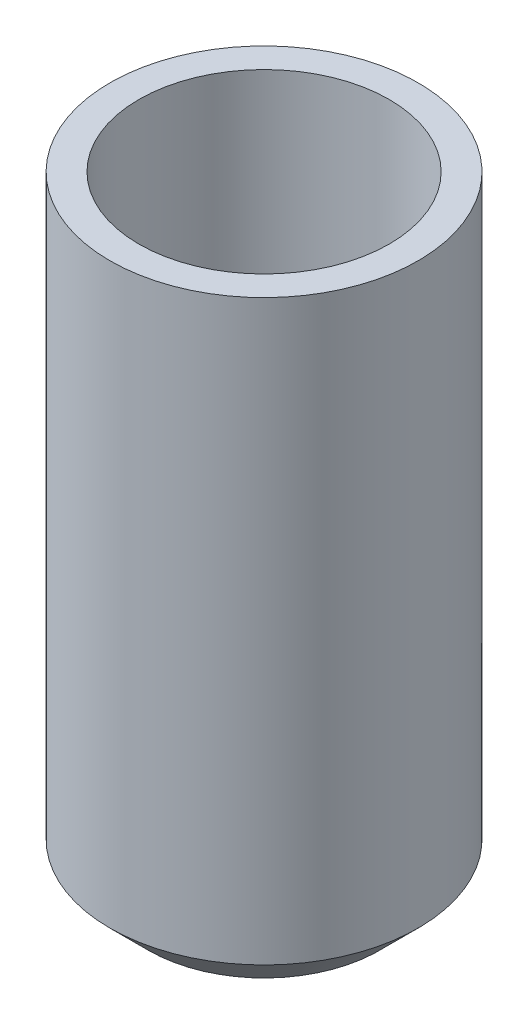
ISO-10303-21;
HEADER;
FILE_DESCRIPTION(('STEP AP214'),'2;1');
FILE_NAME('part.step','',(''),(''),'','','');
FILE_SCHEMA(('AUTOMOTIVE_DESIGN { 1 0 10303 214 1 1 1 1 }'));
ENDSEC;
DATA;
#1=APPLICATION_CONTEXT('core data for automotive mechanical design processes');
#2=APPLICATION_PROTOCOL_DEFINITION('international standard','automotive_design',2000,#1);
#3=PRODUCT_CONTEXT('',#1,'mechanical');
#4=PRODUCT('Part','Part','',(#3));
#5=PRODUCT_RELATED_PRODUCT_CATEGORY('part','',(#4));
#6=PRODUCT_DEFINITION_FORMATION('','',#4);
#7=PRODUCT_DEFINITION_CONTEXT('part definition',#1,'design');
#8=PRODUCT_DEFINITION('design','',#6,#7);
#9=PRODUCT_DEFINITION_SHAPE('','',#8);
#10=(LENGTH_UNIT() NAMED_UNIT(*) SI_UNIT(.MILLI.,.METRE.));
#11=(NAMED_UNIT(*) PLANE_ANGLE_UNIT() SI_UNIT($,.RADIAN.));
#12=(NAMED_UNIT(*) SI_UNIT($,.STERADIAN.) SOLID_ANGLE_UNIT());
#13=UNCERTAINTY_MEASURE_WITH_UNIT(LENGTH_MEASURE(1.E-05),#10,'distance_accuracy_value','');
#14=(GEOMETRIC_REPRESENTATION_CONTEXT(3) GLOBAL_UNCERTAINTY_ASSIGNED_CONTEXT((#13)) GLOBAL_UNIT_ASSIGNED_CONTEXT((#10,
#11,#12)) REPRESENTATION_CONTEXT('',''));
#15=CARTESIAN_POINT('',(0.,0.,0.));
#16=DIRECTION('',(0.,0.,1.));
#17=DIRECTION('',(1.,0.,0.));
#18=AXIS2_PLACEMENT_3D('',#15,#16,#17);
#19=CARTESIAN_POINT('',(0.,-4.48308405515468,0.));
#20=DIRECTION('',(0.,1.,0.));
#21=DIRECTION('',(0.,0.,-1.));
#22=AXIS2_PLACEMENT_3D('',#19,#20,#21);
#23=SPHERICAL_SURFACE('',#22,6.5437442269345);
#24=CARTESIAN_POINT('',(0.,1.5,0.));
#25=DIRECTION('',(0.,1.,0.));
#26=DIRECTION('',(0.,0.,1.));
#27=AXIS2_PLACEMENT_3D('',#24,#25,#26);
#28=CIRCLE('',#27,2.65014974982404);
#29=CARTESIAN_POINT('',(0.,1.5,2.65014974982404));
#30=VERTEX_POINT('',#29);
#31=EDGE_CURVE('E10',#30,#30,#28,.T.);
#32=ORIENTED_EDGE('',*,*,#31,.T.);
#33=EDGE_LOOP('',(#32));
#34=FACE_BOUND('',#33,.T.);
#35=ADVANCED_FACE('F40',(#34),#23,.T.);
#36=CARTESIAN_POINT('',(0.,1.5,-2.65014974982404));
#37=DIRECTION('',(0.,-1.,0.));
#38=DIRECTION('',(0.,0.,-1.));
#39=AXIS2_PLACEMENT_3D('',#36,#37,#38);
#40=PLANE('',#39);
#41=ORIENTED_EDGE('',*,*,#31,.F.);
#42=EDGE_LOOP('',(#41));
#43=FACE_BOUND('',#42,.T.);
#44=CARTESIAN_POINT('',(0.,1.5,0.));
#45=DIRECTION('',(0.,1.,0.));
#46=DIRECTION('',(0.,0.,1.));
#47=AXIS2_PLACEMENT_3D('',#44,#45,#46);
#48=CIRCLE('',#47,5.37867965644036);
#49=CARTESIAN_POINT('',(0.,1.5,5.37867965644036));
#50=VERTEX_POINT('',#49);
#51=EDGE_CURVE('E47',#50,#50,#48,.T.);
#52=ORIENTED_EDGE('',*,*,#51,.T.);
#53=EDGE_LOOP('',(#52));
#54=FACE_BOUND('',#53,.T.);
#55=ADVANCED_FACE('F100',(#43,#54),#40,.F.);
#56=CARTESIAN_POINT('',(0.,2.62132034355964,0.));
#57=DIRECTION('',(0.,1.,0.));
#58=DIRECTION('',(0.,0.,1.));
#59=AXIS2_PLACEMENT_3D('',#56,#57,#58);
#60=CONICAL_SURFACE('',#59,6.5,0.785398163397448);
#61=ORIENTED_EDGE('',*,*,#51,.F.);
#62=EDGE_LOOP('',(#61));
#63=FACE_BOUND('',#62,.T.);
#64=CARTESIAN_POINT('',(0.,2.62132034355964,0.));
#65=DIRECTION('',(0.,1.,0.));
#66=DIRECTION('',(0.,0.,1.));
#67=AXIS2_PLACEMENT_3D('',#64,#65,#66);
#68=CIRCLE('',#67,6.5);
#69=CARTESIAN_POINT('',(0.,2.62132034355964,6.5));
#70=VERTEX_POINT('',#69);
#71=EDGE_CURVE('E52',#70,#70,#68,.T.);
#72=ORIENTED_EDGE('',*,*,#71,.T.);
#73=EDGE_LOOP('',(#72));
#74=FACE_BOUND('',#73,.T.);
#75=ADVANCED_FACE('F104',(#63,#74),#60,.F.);
#76=CARTESIAN_POINT('',(0.,2.06066017177982,0.));
#77=DIRECTION('',(0.,1.,0.));
#78=DIRECTION('',(0.,0.,1.));
#79=AXIS2_PLACEMENT_3D('',#76,#77,#78);
#80=CYLINDRICAL_SURFACE('',#79,6.5);
#81=ORIENTED_EDGE('',*,*,#71,.F.);
#82=EDGE_LOOP('',(#81));
#83=FACE_BOUND('',#82,.T.);
#84=CARTESIAN_POINT('',(0.,6.5,0.));
#85=DIRECTION('',(0.,1.,0.));
#86=DIRECTION('',(0.,0.,1.));
#87=AXIS2_PLACEMENT_3D('',#84,#85,#86);
#88=CIRCLE('',#87,6.5);
#89=CARTESIAN_POINT('',(0.,6.5,6.5));
#90=VERTEX_POINT('',#89);
#91=EDGE_CURVE('E57',#90,#90,#88,.T.);
#92=ORIENTED_EDGE('',*,*,#91,.T.);
#93=EDGE_LOOP('',(#92));
#94=FACE_BOUND('',#93,.T.);
#95=ADVANCED_FACE('F109',(#83,#94),#80,.F.);
#96=CARTESIAN_POINT('',(0.,6.5,-5.37867965644036));
#97=DIRECTION('',(0.,1.,0.));
#98=DIRECTION('',(0.,0.,1.));
#99=AXIS2_PLACEMENT_3D('',#96,#97,#98);
#100=PLANE('',#99);
#101=ORIENTED_EDGE('',*,*,#91,.F.);
#102=EDGE_LOOP('',(#101));
#103=FACE_BOUND('',#102,.T.);
#104=CARTESIAN_POINT('',(0.,6.5,0.));
#105=DIRECTION('',(0.,1.,0.));
#106=DIRECTION('',(0.,0.,1.));
#107=AXIS2_PLACEMENT_3D('',#104,#105,#106);
#108=CIRCLE('',#107,5.37867965644036);
#109=CARTESIAN_POINT('',(0.,6.5,5.37867965644036));
#110=VERTEX_POINT('',#109);
#111=EDGE_CURVE('E63',#110,#110,#108,.T.);
#112=ORIENTED_EDGE('',*,*,#111,.T.);
#113=EDGE_LOOP('',(#112));
#114=FACE_BOUND('',#113,.T.);
#115=ADVANCED_FACE('F115',(#103,#114),#100,.F.);
#116=CARTESIAN_POINT('',(0.,12.0606601717798,0.));
#117=DIRECTION('',(0.,1.,0.));
#118=DIRECTION('',(0.,0.,1.));
#119=AXIS2_PLACEMENT_3D('',#116,#117,#118);
#120=CONICAL_SURFACE('',#119,6.5,0.198983878226247);
#121=ORIENTED_EDGE('',*,*,#111,.F.);
#122=EDGE_LOOP('',(#121));
#123=FACE_BOUND('',#122,.T.);
#124=CARTESIAN_POINT('',(0.,12.0606601717798,0.));
#125=DIRECTION('',(0.,1.,0.));
#126=DIRECTION('',(0.,0.,1.));
#127=AXIS2_PLACEMENT_3D('',#124,#125,#126);
#128=CIRCLE('',#127,6.5);
#129=CARTESIAN_POINT('',(0.,12.0606601717798,6.5));
#130=VERTEX_POINT('',#129);
#131=EDGE_CURVE('E67',#130,#130,#128,.T.);
#132=ORIENTED_EDGE('',*,*,#131,.T.);
#133=EDGE_LOOP('',(#132));
#134=FACE_BOUND('',#133,.T.);
#135=ADVANCED_FACE('F119',(#123,#134),#120,.F.);
#136=CARTESIAN_POINT('',(0.,2.06066017177982,0.));
#137=DIRECTION('',(0.,1.,0.));
#138=DIRECTION('',(0.,0.,1.));
#139=AXIS2_PLACEMENT_3D('',#136,#137,#138);
#140=CYLINDRICAL_SURFACE('',#139,6.5);
#141=ORIENTED_EDGE('',*,*,#131,.F.);
#142=EDGE_LOOP('',(#141));
#143=FACE_BOUND('',#142,.T.);
#144=CARTESIAN_POINT('',(0.,32.,0.));
#145=DIRECTION('',(0.,1.,0.));
#146=DIRECTION('',(0.,0.,1.));
#147=AXIS2_PLACEMENT_3D('',#144,#145,#146);
#148=CIRCLE('',#147,6.5);
#149=CARTESIAN_POINT('',(0.,32.,6.5));
#150=VERTEX_POINT('',#149);
#151=EDGE_CURVE('E71',#150,#150,#148,.T.);
#152=ORIENTED_EDGE('',*,*,#151,.T.);
#153=EDGE_LOOP('',(#152));
#154=FACE_BOUND('',#153,.T.);
#155=ADVANCED_FACE('F123',(#143,#154),#140,.F.);
#156=CARTESIAN_POINT('',(0.,32.,-6.5));
#157=DIRECTION('',(0.,-1.,0.));
#158=DIRECTION('',(0.,0.,-1.));
#159=AXIS2_PLACEMENT_3D('',#156,#157,#158);
#160=PLANE('',#159);
#161=ORIENTED_EDGE('',*,*,#151,.F.);
#162=EDGE_LOOP('',(#161));
#163=FACE_BOUND('',#162,.T.);
#164=CARTESIAN_POINT('',(0.,32.,0.));
#165=DIRECTION('',(0.,1.,0.));
#166=DIRECTION('',(0.,0.,1.));
#167=AXIS2_PLACEMENT_3D('',#164,#165,#166);
#168=CIRCLE('',#167,8.);
#169=CARTESIAN_POINT('',(0.,32.,8.));
#170=VERTEX_POINT('',#169);
#171=EDGE_CURVE('E75',#170,#170,#168,.T.);
#172=ORIENTED_EDGE('',*,*,#171,.T.);
#173=EDGE_LOOP('',(#172));
#174=FACE_BOUND('',#173,.T.);
#175=ADVANCED_FACE('F127',(#163,#174),#160,.F.);
#176=CARTESIAN_POINT('',(0.,2.06066017177982,0.));
#177=DIRECTION('',(0.,1.,0.));
#178=DIRECTION('',(0.,0.,1.));
#179=AXIS2_PLACEMENT_3D('',#176,#177,#178);
#180=CYLINDRICAL_SURFACE('',#179,8.);
#181=ORIENTED_EDGE('',*,*,#171,.F.);
#182=EDGE_LOOP('',(#181));
#183=FACE_BOUND('',#182,.T.);
#184=CARTESIAN_POINT('',(0.,2.,0.));
#185=DIRECTION('',(0.,1.,0.));
#186=DIRECTION('',(0.,0.,1.));
#187=AXIS2_PLACEMENT_3D('',#184,#185,#186);
#188=CIRCLE('',#187,8.);
#189=CARTESIAN_POINT('',(0.,2.,8.));
#190=VERTEX_POINT('',#189);
#191=EDGE_CURVE('E79',#190,#190,#188,.T.);
#192=ORIENTED_EDGE('',*,*,#191,.T.);
#193=EDGE_LOOP('',(#192));
#194=FACE_BOUND('',#193,.T.);
#195=ADVANCED_FACE('F96',(#183,#194),#180,.T.);
#196=CARTESIAN_POINT('',(0.,0.,0.));
#197=DIRECTION('',(0.,1.,0.));
#198=DIRECTION('',(0.,0.,1.));
#199=AXIS2_PLACEMENT_3D('',#196,#197,#198);
#200=CONICAL_SURFACE('',#199,6.,0.785398163397448);
#201=ORIENTED_EDGE('',*,*,#191,.F.);
#202=EDGE_LOOP('',(#201));
#203=FACE_BOUND('',#202,.T.);
#204=CARTESIAN_POINT('',(0.,0.,0.));
#205=DIRECTION('',(0.,1.,0.));
#206=DIRECTION('',(0.,0.,1.));
#207=AXIS2_PLACEMENT_3D('',#204,#205,#206);
#208=CIRCLE('',#207,6.);
#209=CARTESIAN_POINT('',(0.,0.,6.));
#210=VERTEX_POINT('',#209);
#211=EDGE_CURVE('E83',#210,#210,#208,.T.);
#212=ORIENTED_EDGE('',*,*,#211,.T.);
#213=EDGE_LOOP('',(#212));
#214=FACE_BOUND('',#213,.T.);
#215=ADVANCED_FACE('F88',(#203,#214),#200,.T.);
#216=CARTESIAN_POINT('',(0.,0.,0.));
#217=DIRECTION('',(0.,1.,0.));
#218=DIRECTION('',(0.,0.,1.));
#219=AXIS2_PLACEMENT_3D('',#216,#217,#218);
#220=PLANE('',#219);
#221=ORIENTED_EDGE('',*,*,#211,.F.);
#222=EDGE_LOOP('',(#221));
#223=FACE_BOUND('',#222,.T.);
#224=ADVANCED_FACE('F90',(#223),#220,.F.);
#225=CLOSED_SHELL('',(#35,#55,#75,#95,#115,#135,#155,#175,#195,#215,#224));
#226=MANIFOLD_SOLID_BREP('B2',#225);
#227=ADVANCED_BREP_SHAPE_REPRESENTATION('',(#18,#226),#14);
#228=SHAPE_DEFINITION_REPRESENTATION(#9,#227);
ENDSEC;
END-ISO-10303-21;
